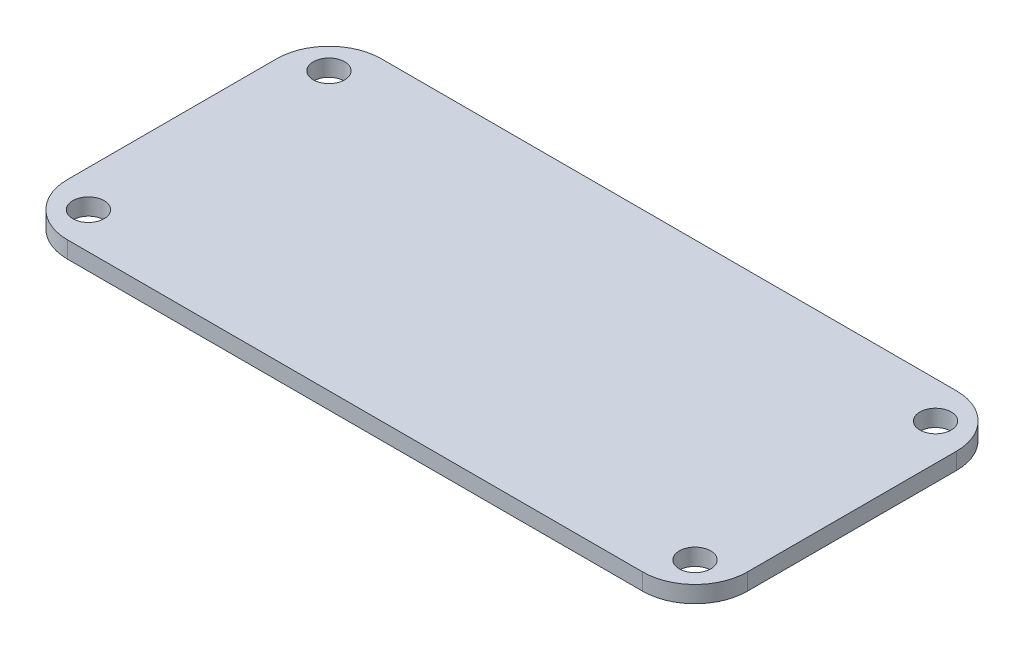
ISO-10303-21;
HEADER;
FILE_DESCRIPTION(('STEP AP214'),'2;1');
FILE_NAME('part.step','',(''),(''),'','','');
FILE_SCHEMA(('AUTOMOTIVE_DESIGN { 1 0 10303 214 1 1 1 1 }'));
ENDSEC;
DATA;
#1=APPLICATION_CONTEXT('core data for automotive mechanical design processes');
#2=APPLICATION_PROTOCOL_DEFINITION('international standard','automotive_design',2000,#1);
#3=PRODUCT_CONTEXT('',#1,'mechanical');
#4=PRODUCT('Part','Part','',(#3));
#5=PRODUCT_RELATED_PRODUCT_CATEGORY('part','',(#4));
#6=PRODUCT_DEFINITION_FORMATION('','',#4);
#7=PRODUCT_DEFINITION_CONTEXT('part definition',#1,'design');
#8=PRODUCT_DEFINITION('design','',#6,#7);
#9=PRODUCT_DEFINITION_SHAPE('','',#8);
#10=(LENGTH_UNIT() NAMED_UNIT(*) SI_UNIT(.MILLI.,.METRE.));
#11=(NAMED_UNIT(*) PLANE_ANGLE_UNIT() SI_UNIT($,.RADIAN.));
#12=(NAMED_UNIT(*) SI_UNIT($,.STERADIAN.) SOLID_ANGLE_UNIT());
#13=UNCERTAINTY_MEASURE_WITH_UNIT(LENGTH_MEASURE(1.E-05),#10,'distance_accuracy_value','');
#14=(GEOMETRIC_REPRESENTATION_CONTEXT(3) GLOBAL_UNCERTAINTY_ASSIGNED_CONTEXT((#13)) GLOBAL_UNIT_ASSIGNED_CONTEXT((#10,
#11,#12)) REPRESENTATION_CONTEXT('',''));
#15=CARTESIAN_POINT('',(0.,0.,0.));
#16=DIRECTION('',(0.,0.,1.));
#17=DIRECTION('',(1.,0.,0.));
#18=AXIS2_PLACEMENT_3D('',#15,#16,#17);
#19=CARTESIAN_POINT('',(27.5,1.6,10.));
#20=DIRECTION('',(0.,1.,0.));
#21=DIRECTION('',(0.,0.,1.));
#22=AXIS2_PLACEMENT_3D('',#19,#20,#21);
#23=PLANE('',#22);
#24=CARTESIAN_POINT('',(29.,1.6,11.5));
#25=DIRECTION('',(0.,1.,0.));
#26=DIRECTION('',(0.,0.,1.));
#27=AXIS2_PLACEMENT_3D('',#24,#25,#26);
#28=CIRCLE('',#27,1.5);
#29=CARTESIAN_POINT('',(29.,1.6,13.));
#30=VERTEX_POINT('',#29);
#31=EDGE_CURVE('E191',#30,#30,#28,.T.);
#32=ORIENTED_EDGE('',*,*,#31,.F.);
#33=EDGE_LOOP('',(#32));
#34=FACE_BOUND('',#33,.T.);
#35=CARTESIAN_POINT('',(-29.,1.6,-11.5));
#36=DIRECTION('',(0.,1.,0.));
#37=DIRECTION('',(0.,0.,1.));
#38=AXIS2_PLACEMENT_3D('',#35,#36,#37);
#39=CIRCLE('',#38,1.5);
#40=CARTESIAN_POINT('',(-29.,1.6,-10.));
#41=VERTEX_POINT('',#40);
#42=EDGE_CURVE('E137',#41,#41,#39,.T.);
#43=ORIENTED_EDGE('',*,*,#42,.F.);
#44=EDGE_LOOP('',(#43));
#45=FACE_BOUND('',#44,.T.);
#46=CARTESIAN_POINT('',(27.5,1.6,10.));
#47=DIRECTION('',(0.,1.,0.));
#48=DIRECTION('',(0.,0.,1.));
#49=AXIS2_PLACEMENT_3D('',#46,#47,#48);
#50=CIRCLE('',#49,5.);
#51=CARTESIAN_POINT('',(27.5,1.6,15.));
#52=VERTEX_POINT('',#51);
#53=CARTESIAN_POINT('',(32.5,1.6,9.99999999999996));
#54=VERTEX_POINT('',#53);
#55=EDGE_CURVE('E148',#52,#54,#50,.T.);
#56=ORIENTED_EDGE('',*,*,#55,.T.);
#57=DIRECTION('',(0.,0.,-1.));
#58=VECTOR('',#57,1.);
#59=CARTESIAN_POINT('',(32.5,1.6,-9.99999999999997));
#60=LINE('',#59,#58);
#61=CARTESIAN_POINT('',(32.5,1.6,-9.99999999999997));
#62=VERTEX_POINT('',#61);
#63=EDGE_CURVE('E96',#54,#62,#60,.T.);
#64=ORIENTED_EDGE('',*,*,#63,.T.);
#65=CARTESIAN_POINT('',(27.5,1.6,-10.));
#66=DIRECTION('',(0.,1.,0.));
#67=DIRECTION('',(0.,0.,-1.));
#68=AXIS2_PLACEMENT_3D('',#65,#66,#67);
#69=CIRCLE('',#68,5.);
#70=CARTESIAN_POINT('',(27.5,1.6,-15.));
#71=VERTEX_POINT('',#70);
#72=EDGE_CURVE('E163',#62,#71,#69,.T.);
#73=ORIENTED_EDGE('',*,*,#72,.T.);
#74=DIRECTION('',(-1.,0.,0.));
#75=VECTOR('',#74,1.);
#76=CARTESIAN_POINT('',(-27.5,1.6,-15.));
#77=LINE('',#76,#75);
#78=CARTESIAN_POINT('',(-27.5,1.6,-15.));
#79=VERTEX_POINT('',#78);
#80=EDGE_CURVE('E176',#71,#79,#77,.T.);
#81=ORIENTED_EDGE('',*,*,#80,.T.);
#82=CARTESIAN_POINT('',(-27.5,1.6,-10.));
#83=DIRECTION('',(0.,1.,0.));
#84=DIRECTION('',(0.,0.,1.));
#85=AXIS2_PLACEMENT_3D('',#82,#83,#84);
#86=CIRCLE('',#85,5.);
#87=CARTESIAN_POINT('',(-32.5,1.6,-9.99999999999996));
#88=VERTEX_POINT('',#87);
#89=EDGE_CURVE('E115',#79,#88,#86,.T.);
#90=ORIENTED_EDGE('',*,*,#89,.T.);
#91=DIRECTION('',(0.,0.,1.));
#92=VECTOR('',#91,1.);
#93=CARTESIAN_POINT('',(-32.5,1.6,-9.99999999999996));
#94=LINE('',#93,#92);
#95=CARTESIAN_POINT('',(-32.5,1.6,9.99999999999996));
#96=VERTEX_POINT('',#95);
#97=EDGE_CURVE('E109',#88,#96,#94,.T.);
#98=ORIENTED_EDGE('',*,*,#97,.T.);
#99=CARTESIAN_POINT('',(-27.5,1.6,10.));
#100=DIRECTION('',(0.,1.,0.));
#101=DIRECTION('',(0.,0.,1.));
#102=AXIS2_PLACEMENT_3D('',#99,#100,#101);
#103=CIRCLE('',#102,5.);
#104=CARTESIAN_POINT('',(-27.5,1.6,15.));
#105=VERTEX_POINT('',#104);
#106=EDGE_CURVE('E113',#96,#105,#103,.T.);
#107=ORIENTED_EDGE('',*,*,#106,.T.);
#108=DIRECTION('',(1.,0.,0.));
#109=VECTOR('',#108,1.);
#110=CARTESIAN_POINT('',(-27.5,1.6,15.));
#111=LINE('',#110,#109);
#112=EDGE_CURVE('E53',#105,#52,#111,.T.);
#113=ORIENTED_EDGE('',*,*,#112,.T.);
#114=EDGE_LOOP('',(#56,#64,#73,#81,#90,#98,#107,#113));
#115=FACE_BOUND('',#114,.T.);
#116=CARTESIAN_POINT('',(29.,1.6,-11.5));
#117=DIRECTION('',(0.,1.,0.));
#118=DIRECTION('',(0.,0.,-1.));
#119=AXIS2_PLACEMENT_3D('',#116,#117,#118);
#120=CIRCLE('',#119,1.5);
#121=CARTESIAN_POINT('',(29.,1.6,-13.));
#122=VERTEX_POINT('',#121);
#123=EDGE_CURVE('E185',#122,#122,#120,.T.);
#124=ORIENTED_EDGE('',*,*,#123,.F.);
#125=EDGE_LOOP('',(#124));
#126=FACE_BOUND('',#125,.T.);
#127=CARTESIAN_POINT('',(-29.,1.6,11.5));
#128=DIRECTION('',(0.,1.,0.));
#129=DIRECTION('',(0.,0.,-1.));
#130=AXIS2_PLACEMENT_3D('',#127,#128,#129);
#131=CIRCLE('',#130,1.5);
#132=CARTESIAN_POINT('',(-29.,1.6,10.));
#133=VERTEX_POINT('',#132);
#134=EDGE_CURVE('E197',#133,#133,#131,.T.);
#135=ORIENTED_EDGE('',*,*,#134,.F.);
#136=EDGE_LOOP('',(#135));
#137=FACE_BOUND('',#136,.T.);
#138=ADVANCED_FACE('F36',(#34,#45,#115,#126,#137),#23,.T.);
#139=CARTESIAN_POINT('',(27.5,0.,10.));
#140=DIRECTION('',(0.,1.,0.));
#141=DIRECTION('',(0.,0.,1.));
#142=AXIS2_PLACEMENT_3D('',#139,#140,#141);
#143=PLANE('',#142);
#144=CARTESIAN_POINT('',(27.5,0.,10.));
#145=DIRECTION('',(0.,1.,0.));
#146=DIRECTION('',(0.,0.,1.));
#147=AXIS2_PLACEMENT_3D('',#144,#145,#146);
#148=CIRCLE('',#147,5.);
#149=CARTESIAN_POINT('',(27.5,0.,15.));
#150=VERTEX_POINT('',#149);
#151=CARTESIAN_POINT('',(32.5,0.,9.99999999999996));
#152=VERTEX_POINT('',#151);
#153=EDGE_CURVE('E133',#150,#152,#148,.T.);
#154=ORIENTED_EDGE('',*,*,#153,.F.);
#155=DIRECTION('',(1.,0.,0.));
#156=VECTOR('',#155,1.);
#157=CARTESIAN_POINT('',(-27.5,0.,15.));
#158=LINE('',#157,#156);
#159=CARTESIAN_POINT('',(-27.5,0.,15.));
#160=VERTEX_POINT('',#159);
#161=EDGE_CURVE('E88',#160,#150,#158,.T.);
#162=ORIENTED_EDGE('',*,*,#161,.F.);
#163=CARTESIAN_POINT('',(-27.5,0.,10.));
#164=DIRECTION('',(0.,1.,0.));
#165=DIRECTION('',(0.,0.,1.));
#166=AXIS2_PLACEMENT_3D('',#163,#164,#165);
#167=CIRCLE('',#166,5.);
#168=CARTESIAN_POINT('',(-32.5,0.,9.99999999999996));
#169=VERTEX_POINT('',#168);
#170=EDGE_CURVE('E82',#169,#160,#167,.T.);
#171=ORIENTED_EDGE('',*,*,#170,.F.);
#172=DIRECTION('',(0.,0.,1.));
#173=VECTOR('',#172,1.);
#174=CARTESIAN_POINT('',(-32.5,0.,-9.99999999999996));
#175=LINE('',#174,#173);
#176=CARTESIAN_POINT('',(-32.5,0.,-9.99999999999996));
#177=VERTEX_POINT('',#176);
#178=EDGE_CURVE('E123',#177,#169,#175,.T.);
#179=ORIENTED_EDGE('',*,*,#178,.F.);
#180=CARTESIAN_POINT('',(-27.5,0.,-10.));
#181=DIRECTION('',(0.,1.,0.));
#182=DIRECTION('',(0.,0.,1.));
#183=AXIS2_PLACEMENT_3D('',#180,#181,#182);
#184=CIRCLE('',#183,5.);
#185=CARTESIAN_POINT('',(-27.5,0.,-15.));
#186=VERTEX_POINT('',#185);
#187=EDGE_CURVE('E143',#186,#177,#184,.T.);
#188=ORIENTED_EDGE('',*,*,#187,.F.);
#189=DIRECTION('',(-1.,0.,0.));
#190=VECTOR('',#189,1.);
#191=CARTESIAN_POINT('',(-27.5,0.,-15.));
#192=LINE('',#191,#190);
#193=CARTESIAN_POINT('',(27.5,0.,-15.));
#194=VERTEX_POINT('',#193);
#195=EDGE_CURVE('E141',#194,#186,#192,.T.);
#196=ORIENTED_EDGE('',*,*,#195,.F.);
#197=CARTESIAN_POINT('',(27.5,0.,-10.));
#198=DIRECTION('',(0.,1.,0.));
#199=DIRECTION('',(0.,0.,-1.));
#200=AXIS2_PLACEMENT_3D('',#197,#198,#199);
#201=CIRCLE('',#200,5.);
#202=CARTESIAN_POINT('',(32.5,0.,-9.99999999999997));
#203=VERTEX_POINT('',#202);
#204=EDGE_CURVE('E139',#203,#194,#201,.T.);
#205=ORIENTED_EDGE('',*,*,#204,.F.);
#206=DIRECTION('',(0.,0.,-1.));
#207=VECTOR('',#206,1.);
#208=CARTESIAN_POINT('',(32.5,0.,-9.99999999999997));
#209=LINE('',#208,#207);
#210=EDGE_CURVE('E136',#152,#203,#209,.T.);
#211=ORIENTED_EDGE('',*,*,#210,.F.);
#212=EDGE_LOOP('',(#154,#162,#171,#179,#188,#196,#205,#211));
#213=FACE_BOUND('',#212,.T.);
#214=CARTESIAN_POINT('',(-29.,0.,-11.5));
#215=DIRECTION('',(0.,1.,0.));
#216=DIRECTION('',(0.,0.,1.));
#217=AXIS2_PLACEMENT_3D('',#214,#215,#216);
#218=CIRCLE('',#217,1.5);
#219=CARTESIAN_POINT('',(-29.,0.,-10.));
#220=VERTEX_POINT('',#219);
#221=EDGE_CURVE('E182',#220,#220,#218,.T.);
#222=ORIENTED_EDGE('',*,*,#221,.T.);
#223=EDGE_LOOP('',(#222));
#224=FACE_BOUND('',#223,.T.);
#225=CARTESIAN_POINT('',(29.,0.,-11.5));
#226=DIRECTION('',(0.,1.,0.));
#227=DIRECTION('',(0.,0.,-1.));
#228=AXIS2_PLACEMENT_3D('',#225,#226,#227);
#229=CIRCLE('',#228,1.5);
#230=CARTESIAN_POINT('',(29.,0.,-13.));
#231=VERTEX_POINT('',#230);
#232=EDGE_CURVE('E188',#231,#231,#229,.T.);
#233=ORIENTED_EDGE('',*,*,#232,.T.);
#234=EDGE_LOOP('',(#233));
#235=FACE_BOUND('',#234,.T.);
#236=CARTESIAN_POINT('',(29.,0.,11.5));
#237=DIRECTION('',(0.,1.,0.));
#238=DIRECTION('',(0.,0.,1.));
#239=AXIS2_PLACEMENT_3D('',#236,#237,#238);
#240=CIRCLE('',#239,1.5);
#241=CARTESIAN_POINT('',(29.,0.,13.));
#242=VERTEX_POINT('',#241);
#243=EDGE_CURVE('E194',#242,#242,#240,.T.);
#244=ORIENTED_EDGE('',*,*,#243,.T.);
#245=EDGE_LOOP('',(#244));
#246=FACE_BOUND('',#245,.T.);
#247=CARTESIAN_POINT('',(-29.,0.,11.5));
#248=DIRECTION('',(0.,1.,0.));
#249=DIRECTION('',(0.,0.,-1.));
#250=AXIS2_PLACEMENT_3D('',#247,#248,#249);
#251=CIRCLE('',#250,1.5);
#252=CARTESIAN_POINT('',(-29.,0.,10.));
#253=VERTEX_POINT('',#252);
#254=EDGE_CURVE('E200',#253,#253,#251,.T.);
#255=ORIENTED_EDGE('',*,*,#254,.T.);
#256=EDGE_LOOP('',(#255));
#257=FACE_BOUND('',#256,.T.);
#258=ADVANCED_FACE('F167',(#213,#224,#235,#246,#257),#143,.F.);
#259=CARTESIAN_POINT('',(27.5,1.6,10.));
#260=DIRECTION('',(0.,-1.,0.));
#261=DIRECTION('',(0.,0.,-1.));
#262=AXIS2_PLACEMENT_3D('',#259,#260,#261);
#263=CYLINDRICAL_SURFACE('',#262,5.);
#264=ORIENTED_EDGE('',*,*,#153,.T.);
#265=DIRECTION('',(0.,-1.,0.));
#266=VECTOR('',#265,1.);
#267=CARTESIAN_POINT('',(32.5,1.6,9.99999999999996));
#268=LINE('',#267,#266);
#269=EDGE_CURVE('E11',#54,#152,#268,.T.);
#270=ORIENTED_EDGE('',*,*,#269,.F.);
#271=ORIENTED_EDGE('',*,*,#55,.F.);
#272=DIRECTION('',(0.,-1.,0.));
#273=VECTOR('',#272,1.);
#274=CARTESIAN_POINT('',(27.5,1.6,15.));
#275=LINE('',#274,#273);
#276=EDGE_CURVE('E129',#52,#150,#275,.T.);
#277=ORIENTED_EDGE('',*,*,#276,.T.);
#278=EDGE_LOOP('',(#264,#270,#271,#277));
#279=FACE_BOUND('',#278,.T.);
#280=ADVANCED_FACE('F38',(#279),#263,.T.);
#281=CARTESIAN_POINT('',(32.5,1.6,-9.99999999999997));
#282=DIRECTION('',(-1.,0.,0.));
#283=DIRECTION('',(0.,0.,1.));
#284=AXIS2_PLACEMENT_3D('',#281,#282,#283);
#285=PLANE('',#284);
#286=ORIENTED_EDGE('',*,*,#210,.T.);
#287=DIRECTION('',(0.,-1.,0.));
#288=VECTOR('',#287,1.);
#289=CARTESIAN_POINT('',(32.5,1.6,-9.99999999999997));
#290=LINE('',#289,#288);
#291=EDGE_CURVE('E45',#62,#203,#290,.T.);
#292=ORIENTED_EDGE('',*,*,#291,.F.);
#293=ORIENTED_EDGE('',*,*,#63,.F.);
#294=ORIENTED_EDGE('',*,*,#269,.T.);
#295=EDGE_LOOP('',(#286,#292,#293,#294));
#296=FACE_BOUND('',#295,.T.);
#297=ADVANCED_FACE('F234',(#296),#285,.F.);
#298=CARTESIAN_POINT('',(27.5,1.6,-10.));
#299=DIRECTION('',(0.,-1.,0.));
#300=DIRECTION('',(0.,0.,-1.));
#301=AXIS2_PLACEMENT_3D('',#298,#299,#300);
#302=CYLINDRICAL_SURFACE('',#301,5.);
#303=ORIENTED_EDGE('',*,*,#204,.T.);
#304=DIRECTION('',(0.,-1.,0.));
#305=VECTOR('',#304,1.);
#306=CARTESIAN_POINT('',(27.5,1.6,-15.));
#307=LINE('',#306,#305);
#308=EDGE_CURVE('E155',#71,#194,#307,.T.);
#309=ORIENTED_EDGE('',*,*,#308,.F.);
#310=ORIENTED_EDGE('',*,*,#72,.F.);
#311=ORIENTED_EDGE('',*,*,#291,.T.);
#312=EDGE_LOOP('',(#303,#309,#310,#311));
#313=FACE_BOUND('',#312,.T.);
#314=ADVANCED_FACE('F161',(#313),#302,.T.);
#315=CARTESIAN_POINT('',(-27.5,1.6,-15.));
#316=DIRECTION('',(0.,0.,1.));
#317=DIRECTION('',(1.,0.,0.));
#318=AXIS2_PLACEMENT_3D('',#315,#316,#317);
#319=PLANE('',#318);
#320=ORIENTED_EDGE('',*,*,#195,.T.);
#321=DIRECTION('',(0.,-1.,0.));
#322=VECTOR('',#321,1.);
#323=CARTESIAN_POINT('',(-27.5,1.6,-15.));
#324=LINE('',#323,#322);
#325=EDGE_CURVE('E152',#79,#186,#324,.T.);
#326=ORIENTED_EDGE('',*,*,#325,.F.);
#327=ORIENTED_EDGE('',*,*,#80,.F.);
#328=ORIENTED_EDGE('',*,*,#308,.T.);
#329=EDGE_LOOP('',(#320,#326,#327,#328));
#330=FACE_BOUND('',#329,.T.);
#331=ADVANCED_FACE('F172',(#330),#319,.F.);
#332=CARTESIAN_POINT('',(-27.5,1.6,-10.));
#333=DIRECTION('',(0.,-1.,0.));
#334=DIRECTION('',(0.,0.,-1.));
#335=AXIS2_PLACEMENT_3D('',#332,#333,#334);
#336=CYLINDRICAL_SURFACE('',#335,5.);
#337=ORIENTED_EDGE('',*,*,#187,.T.);
#338=DIRECTION('',(0.,-1.,0.));
#339=VECTOR('',#338,1.);
#340=CARTESIAN_POINT('',(-32.5,1.6,-9.99999999999996));
#341=LINE('',#340,#339);
#342=EDGE_CURVE('E124',#88,#177,#341,.T.);
#343=ORIENTED_EDGE('',*,*,#342,.F.);
#344=ORIENTED_EDGE('',*,*,#89,.F.);
#345=ORIENTED_EDGE('',*,*,#325,.T.);
#346=EDGE_LOOP('',(#337,#343,#344,#345));
#347=FACE_BOUND('',#346,.T.);
#348=ADVANCED_FACE('F175',(#347),#336,.T.);
#349=CARTESIAN_POINT('',(-32.5,1.6,-9.99999999999996));
#350=DIRECTION('',(1.,0.,0.));
#351=DIRECTION('',(0.,0.,-1.));
#352=AXIS2_PLACEMENT_3D('',#349,#350,#351);
#353=PLANE('',#352);
#354=ORIENTED_EDGE('',*,*,#178,.T.);
#355=DIRECTION('',(0.,-1.,0.));
#356=VECTOR('',#355,1.);
#357=CARTESIAN_POINT('',(-32.5,1.6,9.99999999999996));
#358=LINE('',#357,#356);
#359=EDGE_CURVE('E120',#96,#169,#358,.T.);
#360=ORIENTED_EDGE('',*,*,#359,.F.);
#361=ORIENTED_EDGE('',*,*,#97,.F.);
#362=ORIENTED_EDGE('',*,*,#342,.T.);
#363=EDGE_LOOP('',(#354,#360,#361,#362));
#364=FACE_BOUND('',#363,.T.);
#365=ADVANCED_FACE('F121',(#364),#353,.F.);
#366=CARTESIAN_POINT('',(-27.5,1.6,10.));
#367=DIRECTION('',(0.,-1.,0.));
#368=DIRECTION('',(0.,0.,-1.));
#369=AXIS2_PLACEMENT_3D('',#366,#367,#368);
#370=CYLINDRICAL_SURFACE('',#369,5.);
#371=ORIENTED_EDGE('',*,*,#170,.T.);
#372=DIRECTION('',(0.,-1.,0.));
#373=VECTOR('',#372,1.);
#374=CARTESIAN_POINT('',(-27.5,1.6,15.));
#375=LINE('',#374,#373);
#376=EDGE_CURVE('E125',#105,#160,#375,.T.);
#377=ORIENTED_EDGE('',*,*,#376,.F.);
#378=ORIENTED_EDGE('',*,*,#106,.F.);
#379=ORIENTED_EDGE('',*,*,#359,.T.);
#380=EDGE_LOOP('',(#371,#377,#378,#379));
#381=FACE_BOUND('',#380,.T.);
#382=ADVANCED_FACE('F127',(#381),#370,.T.);
#383=CARTESIAN_POINT('',(-27.5,1.6,15.));
#384=DIRECTION('',(0.,0.,-1.));
#385=DIRECTION('',(-1.,0.,0.));
#386=AXIS2_PLACEMENT_3D('',#383,#384,#385);
#387=PLANE('',#386);
#388=ORIENTED_EDGE('',*,*,#161,.T.);
#389=ORIENTED_EDGE('',*,*,#276,.F.);
#390=ORIENTED_EDGE('',*,*,#112,.F.);
#391=ORIENTED_EDGE('',*,*,#376,.T.);
#392=EDGE_LOOP('',(#388,#389,#390,#391));
#393=FACE_BOUND('',#392,.T.);
#394=ADVANCED_FACE('F222',(#393),#387,.F.);
#395=CARTESIAN_POINT('',(-29.,1.6,-11.5));
#396=DIRECTION('',(0.,-1.,0.));
#397=DIRECTION('',(0.,0.,-1.));
#398=AXIS2_PLACEMENT_3D('',#395,#396,#397);
#399=CYLINDRICAL_SURFACE('',#398,1.5);
#400=ORIENTED_EDGE('',*,*,#42,.T.);
#401=EDGE_LOOP('',(#400));
#402=FACE_BOUND('',#401,.T.);
#403=ORIENTED_EDGE('',*,*,#221,.F.);
#404=EDGE_LOOP('',(#403));
#405=FACE_BOUND('',#404,.T.);
#406=ADVANCED_FACE('F219',(#402,#405),#399,.F.);
#407=CARTESIAN_POINT('',(29.,1.6,-11.5));
#408=DIRECTION('',(0.,-1.,0.));
#409=DIRECTION('',(0.,0.,-1.));
#410=AXIS2_PLACEMENT_3D('',#407,#408,#409);
#411=CYLINDRICAL_SURFACE('',#410,1.5);
#412=ORIENTED_EDGE('',*,*,#123,.T.);
#413=EDGE_LOOP('',(#412));
#414=FACE_BOUND('',#413,.T.);
#415=ORIENTED_EDGE('',*,*,#232,.F.);
#416=EDGE_LOOP('',(#415));
#417=FACE_BOUND('',#416,.T.);
#418=ADVANCED_FACE('F298',(#414,#417),#411,.F.);
#419=CARTESIAN_POINT('',(29.,1.6,11.5));
#420=DIRECTION('',(0.,-1.,0.));
#421=DIRECTION('',(0.,0.,-1.));
#422=AXIS2_PLACEMENT_3D('',#419,#420,#421);
#423=CYLINDRICAL_SURFACE('',#422,1.5);
#424=ORIENTED_EDGE('',*,*,#31,.T.);
#425=EDGE_LOOP('',(#424));
#426=FACE_BOUND('',#425,.T.);
#427=ORIENTED_EDGE('',*,*,#243,.F.);
#428=EDGE_LOOP('',(#427));
#429=FACE_BOUND('',#428,.T.);
#430=ADVANCED_FACE('F306',(#426,#429),#423,.F.);
#431=CARTESIAN_POINT('',(-29.,1.6,11.5));
#432=DIRECTION('',(0.,-1.,0.));
#433=DIRECTION('',(0.,0.,-1.));
#434=AXIS2_PLACEMENT_3D('',#431,#432,#433);
#435=CYLINDRICAL_SURFACE('',#434,1.5);
#436=ORIENTED_EDGE('',*,*,#134,.T.);
#437=EDGE_LOOP('',(#436));
#438=FACE_BOUND('',#437,.T.);
#439=ORIENTED_EDGE('',*,*,#254,.F.);
#440=EDGE_LOOP('',(#439));
#441=FACE_BOUND('',#440,.T.);
#442=ADVANCED_FACE('F206',(#438,#441),#435,.F.);
#443=CLOSED_SHELL('',(#138,#258,#280,#297,#314,#331,#348,#365,#382,#394,#406,#418,#430,#442));
#444=MANIFOLD_SOLID_BREP('B2',#443);
#445=ADVANCED_BREP_SHAPE_REPRESENTATION('',(#18,#444),#14);
#446=SHAPE_DEFINITION_REPRESENTATION(#9,#445);
ENDSEC;
END-ISO-10303-21;
